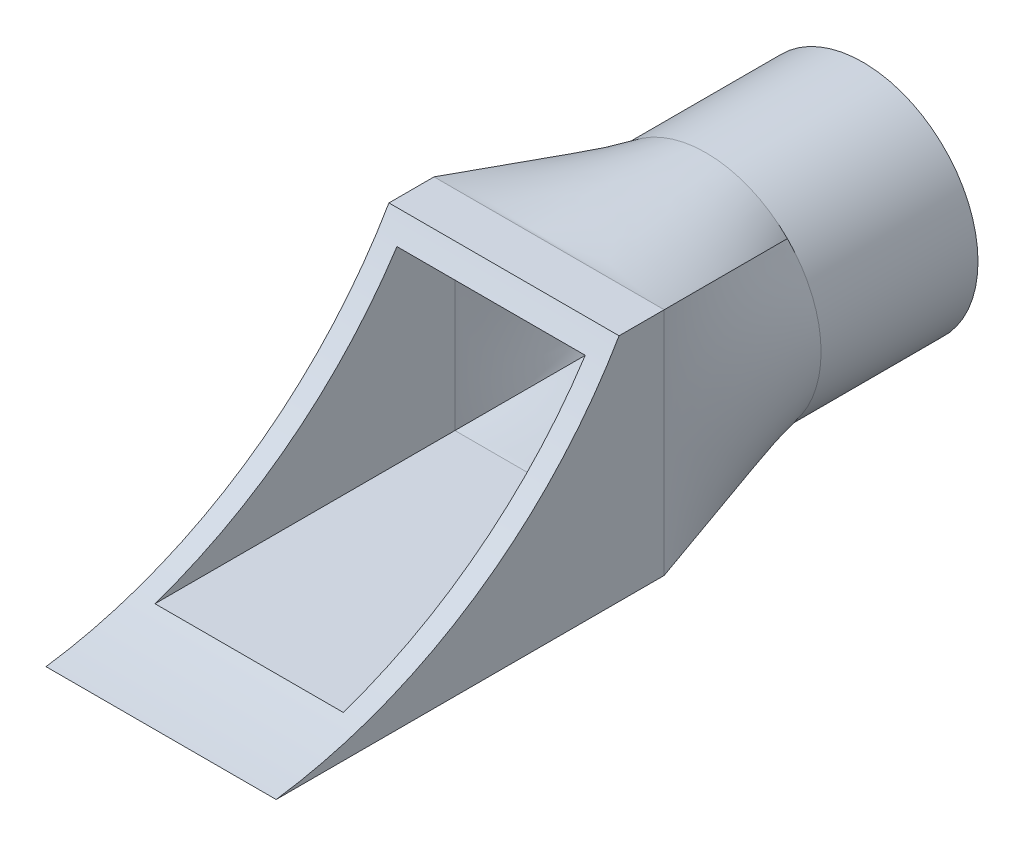
ISO-10303-21;
HEADER;
FILE_DESCRIPTION(('STEP AP214'),'2;1');
FILE_NAME('part.step','',(''),(''),'','','');
FILE_SCHEMA(('AUTOMOTIVE_DESIGN { 1 0 10303 214 1 1 1 1 }'));
ENDSEC;
DATA;
#1=APPLICATION_CONTEXT('core data for automotive mechanical design processes');
#2=APPLICATION_PROTOCOL_DEFINITION('international standard','automotive_design',2000,#1);
#3=PRODUCT_CONTEXT('',#1,'mechanical');
#4=PRODUCT('Part','Part','',(#3));
#5=PRODUCT_RELATED_PRODUCT_CATEGORY('part','',(#4));
#6=PRODUCT_DEFINITION_FORMATION('','',#4);
#7=PRODUCT_DEFINITION_CONTEXT('part definition',#1,'design');
#8=PRODUCT_DEFINITION('design','',#6,#7);
#9=PRODUCT_DEFINITION_SHAPE('','',#8);
#10=(LENGTH_UNIT() NAMED_UNIT(*) SI_UNIT(.MILLI.,.METRE.));
#11=(NAMED_UNIT(*) PLANE_ANGLE_UNIT() SI_UNIT($,.RADIAN.));
#12=(NAMED_UNIT(*) SI_UNIT($,.STERADIAN.) SOLID_ANGLE_UNIT());
#13=UNCERTAINTY_MEASURE_WITH_UNIT(LENGTH_MEASURE(1.E-05),#10,'distance_accuracy_value','');
#14=(GEOMETRIC_REPRESENTATION_CONTEXT(3) GLOBAL_UNCERTAINTY_ASSIGNED_CONTEXT((#13)) GLOBAL_UNIT_ASSIGNED_CONTEXT((#10,
#11,#12)) REPRESENTATION_CONTEXT('',''));
#15=CARTESIAN_POINT('',(0.,0.,0.));
#16=DIRECTION('',(0.,0.,1.));
#17=DIRECTION('',(1.,0.,0.));
#18=AXIS2_PLACEMENT_3D('',#15,#16,#17);
#19=CARTESIAN_POINT('',(-65.7874671161702,179.354700098905,15.));
#20=CARTESIAN_POINT('',(-62.5656417092223,176.132874691957,0.));
#21=CARTESIAN_POINT('',(-64.8708004495035,179.354700098905,15.));
#22=CARTESIAN_POINT('',(-62.1073083758889,176.591208025291,0.));
#23=CARTESIAN_POINT('',(-63.9541337828369,179.354700098905,15.));
#24=CARTESIAN_POINT('',(-61.5910902169784,177.025936624902,0.));
#25=CARTESIAN_POINT('',(-62.1208004495035,179.354700098905,15.));
#26=CARTESIAN_POINT('',(-60.4498049007283,177.810786022859,0.));
#27=CARTESIAN_POINT('',(-61.2041337828368,179.354700098905,15.));
#28=CARTESIAN_POINT('',(-59.8246794607797,178.160652707059,0.));
#29=CARTESIAN_POINT('',(-59.3708004495035,179.354700098905,15.));
#30=CARTESIAN_POINT('',(-58.4881564165403,178.739068806735,0.));
#31=CARTESIAN_POINT('',(-58.4541337828368,179.354700098905,15.));
#32=CARTESIAN_POINT('',(-57.7768634497798,178.96733471297,0.));
#33=CARTESIAN_POINT('',(-56.6208004495035,179.354700098905,15.));
#34=CARTESIAN_POINT('',(-56.3060792205785,179.275245926261,0.));
#35=CARTESIAN_POINT('',(-55.7041337828368,179.354700098905,15.));
#36=CARTESIAN_POINT('',(-55.5468586471876,179.354700098905,0.));
#37=CARTESIAN_POINT('',(-53.8708004495035,179.354700098905,15.));
#38=CARTESIAN_POINT('',(-54.0280755851529,179.354700098905,0.));
#39=CARTESIAN_POINT('',(-52.9541337828368,179.354700098905,15.));
#40=CARTESIAN_POINT('',(-53.2688550117619,179.275245926261,0.));
#41=CARTESIAN_POINT('',(-51.1208004495035,179.354700098905,15.));
#42=CARTESIAN_POINT('',(-51.7980707825607,178.96733471297,0.));
#43=CARTESIAN_POINT('',(-50.2041337828368,179.354700098905,15.));
#44=CARTESIAN_POINT('',(-51.0867778158001,178.739068806735,0.));
#45=CARTESIAN_POINT('',(-48.3708004495035,179.354700098905,15.));
#46=CARTESIAN_POINT('',(-49.7502547715608,178.160652707059,0.));
#47=CARTESIAN_POINT('',(-47.4541337828368,179.354700098905,15.));
#48=CARTESIAN_POINT('',(-49.1251293316122,177.81078602286,0.));
#49=CARTESIAN_POINT('',(-45.6208004495035,179.354700098905,15.));
#50=CARTESIAN_POINT('',(-47.9838440153621,177.025936624902,0.));
#51=CARTESIAN_POINT('',(-44.7041337828369,179.354700098905,15.));
#52=CARTESIAN_POINT('',(-47.4676258564516,176.591208025291,0.));
#53=CARTESIAN_POINT('',(-43.7874671161702,179.354700098905,15.));
#54=CARTESIAN_POINT('',(-47.0092925231182,176.132874691957,0.));
#55=B_SPLINE_SURFACE_WITH_KNOTS('',3,1,((#19,#20),(#21,#22),(#23,#24),(#25,#26),(#27,#28),(#29,
#30),(#31,#32),(#33,#34),(#35,#36),(#37,#38),(#39,#40),(#41,#42),(#43,#44),(#45,#46),(#47,#48),
(#49,#50),(#51,#52),(#53,#54)),.UNSPECIFIED.,.F.,.F.,.F.,(4,2,2,2,2,2,2,2,4),(2,2),(0.,0.125,
0.25,0.375,0.5,0.625,0.75,0.875,1.),(0.,1.),.UNSPECIFIED.);
#56=DIRECTION('',(1.,0.,0.));
#57=VECTOR('',#56,1.);
#58=CARTESIAN_POINT('',(-65.7874671161702,179.354700098905,15.));
#59=LINE('',#58,#57);
#60=CARTESIAN_POINT('',(-65.7874671161702,179.354700098905,15.));
#61=VERTEX_POINT('',#60);
#62=CARTESIAN_POINT('',(-43.7874671161702,179.354700098905,15.));
#63=VERTEX_POINT('',#62);
#64=EDGE_CURVE('E225',#61,#63,#59,.T.);
#65=DIRECTION('',(-0.205516228726018,-0.205516228726016,-0.956831311914734));
#66=VECTOR('',#65,1.);
#67=CARTESIAN_POINT('',(-45.3983798196442,177.743787395431,7.5));
#68=LINE('',#67,#66);
#69=CARTESIAN_POINT('',(-47.0092925231182,176.132874691957,0.));
#70=VERTEX_POINT('',#69);
#71=EDGE_CURVE('E256',#63,#70,#68,.T.);
#72=CARTESIAN_POINT('',(-54.7874671161702,168.354700098905,0.));
#73=DIRECTION('',(0.,0.,1.));
#74=DIRECTION('',(1.,0.,0.));
#75=AXIS2_PLACEMENT_3D('',#72,#73,#74);
#76=CIRCLE('',#75,11.);
#77=CARTESIAN_POINT('',(-62.5656417092223,176.132874691957,0.));
#78=VERTEX_POINT('',#77);
#79=EDGE_CURVE('E122',#70,#78,#76,.T.);
#80=DIRECTION('',(-0.205516228726017,0.205516228726016,0.956831311914734));
#81=VECTOR('',#80,1.);
#82=CARTESIAN_POINT('',(-64.1765544126962,177.743787395431,7.5));
#83=LINE('',#82,#81);
#84=EDGE_CURVE('E242',#78,#61,#83,.T.);
#85=ORIENTED_EDGE('',*,*,#64,.T.);
#86=ORIENTED_EDGE('',*,*,#71,.T.);
#87=ORIENTED_EDGE('',*,*,#79,.T.);
#88=ORIENTED_EDGE('',*,*,#84,.T.);
#89=EDGE_LOOP('',(#85,#86,#87,#88));
#90=FACE_BOUND('',#89,.T.);
#91=ADVANCED_FACE('F101',(#90),#55,.T.);
#92=CARTESIAN_POINT('',(-43.7874671161702,179.354700098905,15.));
#93=CARTESIAN_POINT('',(-47.0092925231182,176.132874691957,0.));
#94=CARTESIAN_POINT('',(-43.7874671161702,178.438033432238,15.));
#95=CARTESIAN_POINT('',(-46.5509591897849,175.674541358624,0.));
#96=CARTESIAN_POINT('',(-43.7874671161702,177.521366765571,15.));
#97=CARTESIAN_POINT('',(-46.1162305901729,175.158323199713,0.));
#98=CARTESIAN_POINT('',(-43.7874671161702,175.688033432238,15.));
#99=CARTESIAN_POINT('',(-45.3313811922159,174.017037883463,0.));
#100=CARTESIAN_POINT('',(-43.7874671161702,174.771366765571,15.));
#101=CARTESIAN_POINT('',(-44.9815145080168,173.391912443515,0.));
#102=CARTESIAN_POINT('',(-43.7874671161702,172.938033432237,15.));
#103=CARTESIAN_POINT('',(-44.40309840834,172.055389399275,0.));
#104=CARTESIAN_POINT('',(-43.7874671161702,172.021366765571,15.));
#105=CARTESIAN_POINT('',(-44.1748325021059,171.344096432515,0.));
#106=CARTESIAN_POINT('',(-43.7874671161702,170.188033432237,15.));
#107=CARTESIAN_POINT('',(-43.8669212888144,169.873312203313,0.));
#108=CARTESIAN_POINT('',(-43.7874671161702,169.27136676557,15.));
#109=CARTESIAN_POINT('',(-43.7874671161702,169.114091629922,0.));
#110=CARTESIAN_POINT('',(-43.7874671161702,167.438033432237,15.));
#111=CARTESIAN_POINT('',(-43.7874671161702,167.595308567888,0.));
#112=CARTESIAN_POINT('',(-43.7874671161702,166.52136676557,15.));
#113=CARTESIAN_POINT('',(-43.8669212888144,166.836087994497,0.));
#114=CARTESIAN_POINT('',(-43.7874671161702,164.688033432237,15.));
#115=CARTESIAN_POINT('',(-44.1748325021059,165.365303765296,0.));
#116=CARTESIAN_POINT('',(-43.7874671161702,163.771366765571,15.));
#117=CARTESIAN_POINT('',(-44.40309840834,164.654010798535,0.));
#118=CARTESIAN_POINT('',(-43.7874671161702,161.938033432238,15.));
#119=CARTESIAN_POINT('',(-44.9815145080168,163.317487754296,0.));
#120=CARTESIAN_POINT('',(-43.7874671161702,161.021366765571,15.));
#121=CARTESIAN_POINT('',(-45.331381192216,162.692362314347,0.));
#122=CARTESIAN_POINT('',(-43.7874671161702,159.188033432238,15.));
#123=CARTESIAN_POINT('',(-46.1162305901729,161.551076998097,0.));
#124=CARTESIAN_POINT('',(-43.7874671161702,158.271366765572,15.));
#125=CARTESIAN_POINT('',(-46.5509591897849,161.034858839187,0.));
#126=CARTESIAN_POINT('',(-43.7874671161702,157.354700098905,15.));
#127=CARTESIAN_POINT('',(-47.0092925231182,160.576525505853,0.));
#128=B_SPLINE_SURFACE_WITH_KNOTS('',3,1,((#92,#93),(#94,#95),(#96,#97),(#98,#99),(#100,#101),
(#102,#103),(#104,#105),(#106,#107),(#108,#109),(#110,#111),(#112,#113),(#114,#115),(#116,#117),
(#118,#119),(#120,#121),(#122,#123),(#124,#125),(#126,#127)),.UNSPECIFIED.,.F.,.F.,.F.,(4,2,2,2,
2,2,2,2,4),(2,2),(0.,0.125,0.25,0.375,0.5,0.625,0.75,0.875,1.),(0.,1.),.UNSPECIFIED.);
#129=DIRECTION('',(0.,1.,0.));
#130=VECTOR('',#129,1.);
#131=CARTESIAN_POINT('',(-43.7874671161702,157.354700098905,15.));
#132=LINE('',#131,#130);
#133=CARTESIAN_POINT('',(-43.7874671161702,157.354700098905,15.));
#134=VERTEX_POINT('',#133);
#135=EDGE_CURVE('E131',#134,#63,#132,.T.);
#136=DIRECTION('',(-0.205516228726018,0.205516228726018,-0.956831311914734));
#137=VECTOR('',#136,1.);
#138=CARTESIAN_POINT('',(-45.3983798196442,158.965612802379,7.5));
#139=LINE('',#138,#137);
#140=CARTESIAN_POINT('',(-47.0092925231182,160.576525505853,0.));
#141=VERTEX_POINT('',#140);
#142=EDGE_CURVE('E237',#134,#141,#139,.T.);
#143=EDGE_CURVE('E114',#141,#70,#76,.T.);
#144=ORIENTED_EDGE('',*,*,#135,.F.);
#145=ORIENTED_EDGE('',*,*,#142,.T.);
#146=ORIENTED_EDGE('',*,*,#143,.T.);
#147=ORIENTED_EDGE('',*,*,#71,.F.);
#148=EDGE_LOOP('',(#144,#145,#146,#147));
#149=FACE_BOUND('',#148,.T.);
#150=ADVANCED_FACE('F275',(#149),#128,.T.);
#151=CARTESIAN_POINT('',(-65.7874671161702,157.354700098905,15.));
#152=CARTESIAN_POINT('',(-62.5656417092223,160.576525505853,0.));
#153=CARTESIAN_POINT('',(-65.7874671161702,158.271366765572,15.));
#154=CARTESIAN_POINT('',(-63.0239750425556,161.034858839187,0.));
#155=CARTESIAN_POINT('',(-65.7874671161702,159.188033432239,15.));
#156=CARTESIAN_POINT('',(-63.4587036421675,161.551076998097,0.));
#157=CARTESIAN_POINT('',(-65.7874671161702,161.021366765572,15.));
#158=CARTESIAN_POINT('',(-64.2435530401245,162.692362314347,0.));
#159=CARTESIAN_POINT('',(-65.7874671161702,161.938033432239,15.));
#160=CARTESIAN_POINT('',(-64.5934197243237,163.317487754296,0.));
#161=CARTESIAN_POINT('',(-65.7874671161702,163.771366765572,15.));
#162=CARTESIAN_POINT('',(-65.1718358240005,164.654010798535,0.));
#163=CARTESIAN_POINT('',(-65.7874671161702,164.688033432239,15.));
#164=CARTESIAN_POINT('',(-65.4001017302346,165.365303765296,0.));
#165=CARTESIAN_POINT('',(-65.7874671161702,166.521366765572,15.));
#166=CARTESIAN_POINT('',(-65.7080129435261,166.836087994497,0.));
#167=CARTESIAN_POINT('',(-65.7874671161702,167.438033432239,15.));
#168=CARTESIAN_POINT('',(-65.7874671161702,167.595308567888,0.));
#169=CARTESIAN_POINT('',(-65.7874671161702,169.271366765572,15.));
#170=CARTESIAN_POINT('',(-65.7874671161702,169.114091629923,0.));
#171=CARTESIAN_POINT('',(-65.7874671161702,170.188033432239,15.));
#172=CARTESIAN_POINT('',(-65.7080129435261,169.873312203313,0.));
#173=CARTESIAN_POINT('',(-65.7874671161702,172.021366765572,15.));
#174=CARTESIAN_POINT('',(-65.4001017302345,171.344096432515,0.));
#175=CARTESIAN_POINT('',(-65.7874671161702,172.938033432239,15.));
#176=CARTESIAN_POINT('',(-65.1718358240005,172.055389399275,0.));
#177=CARTESIAN_POINT('',(-65.7874671161702,174.771366765572,15.));
#178=CARTESIAN_POINT('',(-64.5934197243237,173.391912443515,0.));
#179=CARTESIAN_POINT('',(-65.7874671161702,175.688033432239,15.));
#180=CARTESIAN_POINT('',(-64.2435530401245,174.017037883463,0.));
#181=CARTESIAN_POINT('',(-65.7874671161702,177.521366765572,15.));
#182=CARTESIAN_POINT('',(-63.4587036421675,175.158323199713,0.));
#183=CARTESIAN_POINT('',(-65.7874671161702,178.438033432239,15.));
#184=CARTESIAN_POINT('',(-63.0239750425556,175.674541358624,0.));
#185=CARTESIAN_POINT('',(-65.7874671161702,179.354700098905,15.));
#186=CARTESIAN_POINT('',(-62.5656417092223,176.132874691957,0.));
#187=B_SPLINE_SURFACE_WITH_KNOTS('',3,1,((#151,#152),(#153,#154),(#155,#156),(#157,#158),(#159,
#160),(#161,#162),(#163,#164),(#165,#166),(#167,#168),(#169,#170),(#171,#172),(#173,#174),(#175,
#176),(#177,#178),(#179,#180),(#181,#182),(#183,#184),(#185,#186)),.UNSPECIFIED.,.F.,.F.,.F.,(4,
2,2,2,2,2,2,2,4),(2,2),(0.,0.125,0.25,0.375,0.5,0.625,0.75,0.875,1.),(0.,1.),.UNSPECIFIED.);
#188=DIRECTION('',(0.,1.,0.));
#189=VECTOR('',#188,1.);
#190=CARTESIAN_POINT('',(-65.7874671161702,157.354700098905,15.));
#191=LINE('',#190,#189);
#192=CARTESIAN_POINT('',(-65.7874671161702,157.354700098905,15.));
#193=VERTEX_POINT('',#192);
#194=EDGE_CURVE('E214',#193,#61,#191,.T.);
#195=CARTESIAN_POINT('',(-62.5656417092223,160.576525505853,0.));
#196=VERTEX_POINT('',#195);
#197=EDGE_CURVE('E234',#78,#196,#76,.T.);
#198=DIRECTION('',(0.205516228726017,0.205516228726018,-0.956831311914734));
#199=VECTOR('',#198,1.);
#200=CARTESIAN_POINT('',(-64.1765544126962,158.965612802379,7.5));
#201=LINE('',#200,#199);
#202=EDGE_CURVE('E232',#193,#196,#201,.T.);
#203=ORIENTED_EDGE('',*,*,#194,.T.);
#204=ORIENTED_EDGE('',*,*,#84,.F.);
#205=ORIENTED_EDGE('',*,*,#197,.T.);
#206=ORIENTED_EDGE('',*,*,#202,.F.);
#207=EDGE_LOOP('',(#203,#204,#205,#206));
#208=FACE_BOUND('',#207,.T.);
#209=ADVANCED_FACE('F233',(#208),#187,.T.);
#210=CARTESIAN_POINT('',(-43.7874671161702,157.354700098905,15.));
#211=CARTESIAN_POINT('',(-47.0092925231182,160.576525505853,0.));
#212=CARTESIAN_POINT('',(-44.7041337828369,157.354700098905,15.));
#213=CARTESIAN_POINT('',(-47.4676258564516,160.11819217252,0.));
#214=CARTESIAN_POINT('',(-45.6208004495036,157.354700098905,15.));
#215=CARTESIAN_POINT('',(-47.9838440153621,159.683463572908,0.));
#216=CARTESIAN_POINT('',(-47.4541337828369,157.354700098905,15.));
#217=CARTESIAN_POINT('',(-49.1251293316122,158.898614174951,0.));
#218=CARTESIAN_POINT('',(-48.3708004495036,157.354700098905,15.));
#219=CARTESIAN_POINT('',(-49.7502547715608,158.548747490752,0.));
#220=CARTESIAN_POINT('',(-50.2041337828369,157.354700098905,15.));
#221=CARTESIAN_POINT('',(-51.0867778158002,157.970331391075,0.));
#222=CARTESIAN_POINT('',(-51.1208004495036,157.354700098905,15.));
#223=CARTESIAN_POINT('',(-51.7980707825607,157.742065484841,0.));
#224=CARTESIAN_POINT('',(-52.9541337828369,157.354700098905,15.));
#225=CARTESIAN_POINT('',(-53.2688550117619,157.434154271549,0.));
#226=CARTESIAN_POINT('',(-53.8708004495036,157.354700098905,15.));
#227=CARTESIAN_POINT('',(-54.0280755851529,157.354700098905,0.));
#228=CARTESIAN_POINT('',(-55.7041337828369,157.354700098905,15.));
#229=CARTESIAN_POINT('',(-55.5468586471876,157.354700098905,0.));
#230=CARTESIAN_POINT('',(-56.6208004495036,157.354700098905,15.));
#231=CARTESIAN_POINT('',(-56.3060792205785,157.434154271549,0.));
#232=CARTESIAN_POINT('',(-58.4541337828369,157.354700098905,15.));
#233=CARTESIAN_POINT('',(-57.7768634497798,157.742065484841,0.));
#234=CARTESIAN_POINT('',(-59.3708004495036,157.354700098905,15.));
#235=CARTESIAN_POINT('',(-58.4881564165403,157.970331391075,0.));
#236=CARTESIAN_POINT('',(-61.2041337828369,157.354700098905,15.));
#237=CARTESIAN_POINT('',(-59.8246794607797,158.548747490752,0.));
#238=CARTESIAN_POINT('',(-62.1208004495036,157.354700098905,15.));
#239=CARTESIAN_POINT('',(-60.4498049007283,158.898614174951,0.));
#240=CARTESIAN_POINT('',(-63.9541337828369,157.354700098905,15.));
#241=CARTESIAN_POINT('',(-61.5910902169784,159.683463572908,0.));
#242=CARTESIAN_POINT('',(-64.8708004495036,157.354700098905,15.));
#243=CARTESIAN_POINT('',(-62.1073083758889,160.11819217252,0.));
#244=CARTESIAN_POINT('',(-65.7874671161702,157.354700098905,15.));
#245=CARTESIAN_POINT('',(-62.5656417092223,160.576525505853,0.));
#246=B_SPLINE_SURFACE_WITH_KNOTS('',3,1,((#210,#211),(#212,#213),(#214,#215),(#216,#217),(#218,
#219),(#220,#221),(#222,#223),(#224,#225),(#226,#227),(#228,#229),(#230,#231),(#232,#233),(#234,
#235),(#236,#237),(#238,#239),(#240,#241),(#242,#243),(#244,#245)),.UNSPECIFIED.,.F.,.F.,.F.,(4,
2,2,2,2,2,2,2,4),(2,2),(0.,0.125,0.25,0.375,0.5,0.625,0.75,0.875,1.),(0.,1.),.UNSPECIFIED.);
#247=DIRECTION('',(1.,0.,0.));
#248=VECTOR('',#247,1.);
#249=CARTESIAN_POINT('',(-65.7874671161702,157.354700098905,15.));
#250=LINE('',#249,#248);
#251=EDGE_CURVE('E205',#193,#134,#250,.T.);
#252=EDGE_CURVE('E12',#196,#141,#76,.T.);
#253=ORIENTED_EDGE('',*,*,#251,.F.);
#254=ORIENTED_EDGE('',*,*,#202,.T.);
#255=ORIENTED_EDGE('',*,*,#252,.T.);
#256=ORIENTED_EDGE('',*,*,#142,.F.);
#257=EDGE_LOOP('',(#253,#254,#255,#256));
#258=FACE_BOUND('',#257,.T.);
#259=ADVANCED_FACE('F103',(#258),#246,.T.);
#260=CARTESIAN_POINT('',(-61.1514281468492,174.718661129584,0.));
#261=CARTESIAN_POINT('',(-63.7874671161702,177.354700098905,15.));
#262=CARTESIAN_POINT('',(-61.5264281468491,174.343661129584,0.));
#263=CARTESIAN_POINT('',(-63.7874671161702,176.604700098905,15.));
#264=CARTESIAN_POINT('',(-61.8821151828953,173.921300817748,0.));
#265=CARTESIAN_POINT('',(-63.7874671161702,175.854700098905,15.));
#266=CARTESIAN_POINT('',(-62.5242646903146,172.987521922635,0.));
#267=CARTESIAN_POINT('',(-63.7874671161702,174.354700098905,15.));
#268=CARTESIAN_POINT('',(-62.8105192501139,172.476055653586,0.));
#269=CARTESIAN_POINT('',(-63.7874671161702,173.604700098904,15.));
#270=CARTESIAN_POINT('',(-63.2837687862132,171.382536799208,0.));
#271=CARTESIAN_POINT('',(-63.7874671161702,172.104700098904,15.));
#272=CARTESIAN_POINT('',(-63.4705318004047,170.800569826404,0.));
#273=CARTESIAN_POINT('',(-63.7874671161702,171.354700098904,15.));
#274=CARTESIAN_POINT('',(-63.7224591567341,169.597200911603,0.));
#275=CARTESIAN_POINT('',(-63.7874671161702,169.854700098904,15.));
#276=CARTESIAN_POINT('',(-63.7874671161703,168.976020442465,0.));
#277=CARTESIAN_POINT('',(-63.7874671161702,169.104700098904,15.));
#278=CARTESIAN_POINT('',(-63.7874671161703,167.733379755346,0.));
#279=CARTESIAN_POINT('',(-63.7874671161702,167.604700098904,15.));
#280=CARTESIAN_POINT('',(-63.7224591567341,167.112199286208,0.));
#281=CARTESIAN_POINT('',(-63.7874671161702,166.854700098904,15.));
#282=CARTESIAN_POINT('',(-63.4705318004047,165.908830371406,0.));
#283=CARTESIAN_POINT('',(-63.7874671161702,165.354700098904,15.));
#284=CARTESIAN_POINT('',(-63.2837687862131,165.326863398602,0.));
#285=CARTESIAN_POINT('',(-63.7874671161702,164.604700098904,15.));
#286=CARTESIAN_POINT('',(-62.8105192501139,164.233344544225,0.));
#287=CARTESIAN_POINT('',(-63.7874671161702,163.104700098904,15.));
#288=CARTESIAN_POINT('',(-62.5242646903147,163.721878275176,0.));
#289=CARTESIAN_POINT('',(-63.7874671161702,162.354700098905,15.));
#290=CARTESIAN_POINT('',(-61.8821151828953,162.788099380062,0.));
#291=CARTESIAN_POINT('',(-63.7874671161702,160.854700098905,15.));
#292=CARTESIAN_POINT('',(-61.5264281468492,162.365739068226,0.));
#293=CARTESIAN_POINT('',(-63.7874671161702,160.104700098905,15.));
#294=CARTESIAN_POINT('',(-61.1514281468492,161.990739068226,0.));
#295=CARTESIAN_POINT('',(-63.7874671161702,159.354700098905,15.));
#296=B_SPLINE_SURFACE_WITH_KNOTS('',3,1,((#260,#261),(#262,#263),(#264,#265),(#266,#267),(#268,
#269),(#270,#271),(#272,#273),(#274,#275),(#276,#277),(#278,#279),(#280,#281),(#282,#283),(#284,
#285),(#286,#287),(#288,#289),(#290,#291),(#292,#293),(#294,#295)),.UNSPECIFIED.,.F.,.F.,.F.,(4,
2,2,2,2,2,2,2,4),(2,2),(0.,0.125000000000001,0.25,0.375,0.5,0.625,0.75,0.874999999999999,1.),
(0.,1.),.UNSPECIFIED.);
#297=CARTESIAN_POINT('',(-54.7874671161702,168.354700098905,0.));
#298=DIRECTION('',(0.,0.,1.));
#299=DIRECTION('',(1.,0.,0.));
#300=AXIS2_PLACEMENT_3D('',#297,#298,#299);
#301=CIRCLE('',#300,9.00000000000001);
#302=CARTESIAN_POINT('',(-61.1514281468492,174.718661129584,0.));
#303=VERTEX_POINT('',#302);
#304=CARTESIAN_POINT('',(-61.1514281468492,161.990739068226,0.));
#305=VERTEX_POINT('',#304);
#306=EDGE_CURVE('E326',#303,#305,#301,.T.);
#307=DIRECTION('',(0.170547796263502,-0.170547796263502,-0.970477665059493));
#308=VECTOR('',#307,1.);
#309=CARTESIAN_POINT('',(-62.4694476315097,176.036680614245,7.5));
#310=LINE('',#309,#308);
#311=CARTESIAN_POINT('',(-63.7874671161702,177.354700098905,15.));
#312=VERTEX_POINT('',#311);
#313=EDGE_CURVE('E312',#312,#303,#310,.T.);
#314=DIRECTION('',(0.,1.,0.));
#315=VECTOR('',#314,1.);
#316=CARTESIAN_POINT('',(-63.7874671161702,159.354700098905,15.));
#317=LINE('',#316,#315);
#318=CARTESIAN_POINT('',(-63.7874671161702,159.354700098905,15.));
#319=VERTEX_POINT('',#318);
#320=EDGE_CURVE('E490',#319,#312,#317,.T.);
#321=DIRECTION('',(-0.170547796263502,-0.170547796263503,0.970477665059493));
#322=VECTOR('',#321,1.);
#323=CARTESIAN_POINT('',(-62.4694476315097,160.672719583566,7.5));
#324=LINE('',#323,#322);
#325=EDGE_CURVE('E483',#305,#319,#324,.T.);
#326=ORIENTED_EDGE('',*,*,#306,.F.);
#327=ORIENTED_EDGE('',*,*,#313,.F.);
#328=ORIENTED_EDGE('',*,*,#320,.F.);
#329=ORIENTED_EDGE('',*,*,#325,.F.);
#330=EDGE_LOOP('',(#326,#327,#328,#329));
#331=FACE_BOUND('',#330,.T.);
#332=ADVANCED_FACE('F497',(#331),#296,.F.);
#333=CARTESIAN_POINT('',(-61.1514281468492,161.990739068226,0.));
#334=CARTESIAN_POINT('',(-63.7874671161702,159.354700098905,15.));
#335=CARTESIAN_POINT('',(-60.7764281468491,161.615739068226,0.));
#336=CARTESIAN_POINT('',(-63.0374671161702,159.354700098905,15.));
#337=CARTESIAN_POINT('',(-60.3540678350133,161.26005203218,0.));
#338=CARTESIAN_POINT('',(-62.2874671161702,159.354700098905,15.));
#339=CARTESIAN_POINT('',(-59.4202889398996,160.617902524761,0.));
#340=CARTESIAN_POINT('',(-60.7874671161702,159.354700098905,15.));
#341=CARTESIAN_POINT('',(-58.9088226708507,160.331647964961,0.));
#342=CARTESIAN_POINT('',(-60.0374671161702,159.354700098905,15.));
#343=CARTESIAN_POINT('',(-57.815303816473,159.858398428862,0.));
#344=CARTESIAN_POINT('',(-58.5374671161702,159.354700098905,15.));
#345=CARTESIAN_POINT('',(-57.233336843669,159.671635414671,0.));
#346=CARTESIAN_POINT('',(-57.7874671161702,159.354700098905,15.));
#347=CARTESIAN_POINT('',(-56.0299679288679,159.419708058341,0.));
#348=CARTESIAN_POINT('',(-56.2874671161702,159.354700098905,15.));
#349=CARTESIAN_POINT('',(-55.4087874597299,159.354700098905,0.));
#350=CARTESIAN_POINT('',(-55.5374671161702,159.354700098905,15.));
#351=CARTESIAN_POINT('',(-54.1661467726106,159.354700098905,0.));
#352=CARTESIAN_POINT('',(-54.0374671161702,159.354700098905,15.));
#353=CARTESIAN_POINT('',(-53.5449663034725,159.419708058341,0.));
#354=CARTESIAN_POINT('',(-53.2874671161702,159.354700098905,15.));
#355=CARTESIAN_POINT('',(-52.3415973886715,159.671635414671,0.));
#356=CARTESIAN_POINT('',(-51.7874671161702,159.354700098905,15.));
#357=CARTESIAN_POINT('',(-51.7596304158674,159.858398428862,0.));
#358=CARTESIAN_POINT('',(-51.0374671161702,159.354700098905,15.));
#359=CARTESIAN_POINT('',(-50.6661115614898,160.331647964961,0.));
#360=CARTESIAN_POINT('',(-49.5374671161702,159.354700098905,15.));
#361=CARTESIAN_POINT('',(-50.1546452924409,160.617902524761,0.));
#362=CARTESIAN_POINT('',(-48.7874671161702,159.354700098905,15.));
#363=CARTESIAN_POINT('',(-49.2208663973272,161.26005203218,0.));
#364=CARTESIAN_POINT('',(-47.2874671161702,159.354700098905,15.));
#365=CARTESIAN_POINT('',(-48.7985060854913,161.615739068226,0.));
#366=CARTESIAN_POINT('',(-46.5374671161702,159.354700098905,15.));
#367=CARTESIAN_POINT('',(-48.4235060854913,161.990739068226,0.));
#368=CARTESIAN_POINT('',(-45.7874671161702,159.354700098905,15.));
#369=B_SPLINE_SURFACE_WITH_KNOTS('',3,1,((#333,#334),(#335,#336),(#337,#338),(#339,#340),(#341,
#342),(#343,#344),(#345,#346),(#347,#348),(#349,#350),(#351,#352),(#353,#354),(#355,#356),(#357,
#358),(#359,#360),(#361,#362),(#363,#364),(#365,#366),(#367,#368)),.UNSPECIFIED.,.F.,.F.,.F.,(4,
2,2,2,2,2,2,2,4),(2,2),(0.,0.125,0.25,0.375,0.5,0.625,0.75,0.875,1.),(0.,1.),.UNSPECIFIED.);
#370=CARTESIAN_POINT('',(-48.4235060854913,161.990739068226,0.));
#371=VERTEX_POINT('',#370);
#372=EDGE_CURVE('E314',#305,#371,#301,.T.);
#373=DIRECTION('',(1.,0.,0.));
#374=VECTOR('',#373,1.);
#375=CARTESIAN_POINT('',(-63.7874671161702,159.354700098905,15.));
#376=LINE('',#375,#374);
#377=CARTESIAN_POINT('',(-45.7874671161702,159.354700098905,15.));
#378=VERTEX_POINT('',#377);
#379=EDGE_CURVE('E226',#319,#378,#376,.T.);
#380=DIRECTION('',(0.170547796263504,-0.170547796263503,0.970477665059493));
#381=VECTOR('',#380,1.);
#382=CARTESIAN_POINT('',(-47.1054866008308,160.672719583566,7.5));
#383=LINE('',#382,#381);
#384=EDGE_CURVE('E609',#371,#378,#383,.T.);
#385=ORIENTED_EDGE('',*,*,#372,.F.);
#386=ORIENTED_EDGE('',*,*,#325,.T.);
#387=ORIENTED_EDGE('',*,*,#379,.T.);
#388=ORIENTED_EDGE('',*,*,#384,.F.);
#389=EDGE_LOOP('',(#385,#386,#387,#388));
#390=FACE_BOUND('',#389,.T.);
#391=ADVANCED_FACE('F508',(#390),#369,.F.);
#392=CARTESIAN_POINT('',(-48.4235060854913,174.718661129584,0.));
#393=CARTESIAN_POINT('',(-45.7874671161702,177.354700098905,15.));
#394=CARTESIAN_POINT('',(-48.7985060854913,175.093661129584,0.));
#395=CARTESIAN_POINT('',(-46.5374671161702,177.354700098905,15.));
#396=CARTESIAN_POINT('',(-49.2208663973272,175.44934816563,0.));
#397=CARTESIAN_POINT('',(-47.2874671161702,177.354700098905,15.));
#398=CARTESIAN_POINT('',(-50.1546452924409,176.09149767305,0.));
#399=CARTESIAN_POINT('',(-48.7874671161702,177.354700098905,15.));
#400=CARTESIAN_POINT('',(-50.6661115614898,176.377752232849,0.));
#401=CARTESIAN_POINT('',(-49.5374671161702,177.354700098905,15.));
#402=CARTESIAN_POINT('',(-51.7596304158674,176.851001768948,0.));
#403=CARTESIAN_POINT('',(-51.0374671161702,177.354700098905,15.));
#404=CARTESIAN_POINT('',(-52.3415973886715,177.03776478314,0.));
#405=CARTESIAN_POINT('',(-51.7874671161702,177.354700098905,15.));
#406=CARTESIAN_POINT('',(-53.5449663034725,177.289692139469,0.));
#407=CARTESIAN_POINT('',(-53.2874671161702,177.354700098905,15.));
#408=CARTESIAN_POINT('',(-54.1661467726106,177.354700098905,0.));
#409=CARTESIAN_POINT('',(-54.0374671161702,177.354700098905,15.));
#410=CARTESIAN_POINT('',(-55.4087874597299,177.354700098905,0.));
#411=CARTESIAN_POINT('',(-55.5374671161702,177.354700098905,15.));
#412=CARTESIAN_POINT('',(-56.0299679288679,177.289692139469,0.));
#413=CARTESIAN_POINT('',(-56.2874671161702,177.354700098905,15.));
#414=CARTESIAN_POINT('',(-57.233336843669,177.03776478314,0.));
#415=CARTESIAN_POINT('',(-57.7874671161702,177.354700098905,15.));
#416=CARTESIAN_POINT('',(-57.815303816473,176.851001768948,0.));
#417=CARTESIAN_POINT('',(-58.5374671161702,177.354700098905,15.));
#418=CARTESIAN_POINT('',(-58.9088226708507,176.377752232849,0.));
#419=CARTESIAN_POINT('',(-60.0374671161702,177.354700098905,15.));
#420=CARTESIAN_POINT('',(-59.4202889398996,176.09149767305,0.));
#421=CARTESIAN_POINT('',(-60.7874671161702,177.354700098905,15.));
#422=CARTESIAN_POINT('',(-60.3540678350133,175.44934816563,0.));
#423=CARTESIAN_POINT('',(-62.2874671161702,177.354700098905,15.));
#424=CARTESIAN_POINT('',(-60.7764281468492,175.093661129584,0.));
#425=CARTESIAN_POINT('',(-63.0374671161702,177.354700098905,15.));
#426=CARTESIAN_POINT('',(-61.1514281468492,174.718661129584,0.));
#427=CARTESIAN_POINT('',(-63.7874671161702,177.354700098905,15.));
#428=B_SPLINE_SURFACE_WITH_KNOTS('',3,1,((#392,#393),(#394,#395),(#396,#397),(#398,#399),(#400,
#401),(#402,#403),(#404,#405),(#406,#407),(#408,#409),(#410,#411),(#412,#413),(#414,#415),(#416,
#417),(#418,#419),(#420,#421),(#422,#423),(#424,#425),(#426,#427)),.UNSPECIFIED.,.F.,.F.,.F.,(4,
2,2,2,2,2,2,2,4),(2,2),(0.,0.125,0.25,0.375,0.5,0.625,0.75,0.875,1.),(0.,1.),.UNSPECIFIED.);
#429=CARTESIAN_POINT('',(-48.4235060854913,174.718661129584,0.));
#430=VERTEX_POINT('',#429);
#431=EDGE_CURVE('E313',#430,#303,#301,.T.);
#432=DIRECTION('',(0.170547796263503,0.170547796263502,0.970477665059493));
#433=VECTOR('',#432,1.);
#434=CARTESIAN_POINT('',(-47.1054866008308,176.036680614245,7.5));
#435=LINE('',#434,#433);
#436=CARTESIAN_POINT('',(-45.7874671161702,177.354700098905,15.));
#437=VERTEX_POINT('',#436);
#438=EDGE_CURVE('E608',#430,#437,#435,.T.);
#439=DIRECTION('',(1.,0.,0.));
#440=VECTOR('',#439,1.);
#441=CARTESIAN_POINT('',(-63.7874671161702,177.354700098905,15.));
#442=LINE('',#441,#440);
#443=EDGE_CURVE('E108',#312,#437,#442,.T.);
#444=ORIENTED_EDGE('',*,*,#431,.F.);
#445=ORIENTED_EDGE('',*,*,#438,.T.);
#446=ORIENTED_EDGE('',*,*,#443,.F.);
#447=ORIENTED_EDGE('',*,*,#313,.T.);
#448=EDGE_LOOP('',(#444,#445,#446,#447));
#449=FACE_BOUND('',#448,.T.);
#450=ADVANCED_FACE('F442',(#449),#428,.F.);
#451=CARTESIAN_POINT('',(-48.4235060854913,161.990739068226,0.));
#452=CARTESIAN_POINT('',(-45.7874671161702,159.354700098905,15.));
#453=CARTESIAN_POINT('',(-48.0485060854913,162.365739068226,0.));
#454=CARTESIAN_POINT('',(-45.7874671161702,160.104700098905,15.));
#455=CARTESIAN_POINT('',(-47.6928190494452,162.788099380062,0.));
#456=CARTESIAN_POINT('',(-45.7874671161702,160.854700098905,15.));
#457=CARTESIAN_POINT('',(-47.0506695420258,163.721878275176,0.));
#458=CARTESIAN_POINT('',(-45.7874671161702,162.354700098905,15.));
#459=CARTESIAN_POINT('',(-46.7644149822265,164.233344544225,0.));
#460=CARTESIAN_POINT('',(-45.7874671161702,163.104700098905,15.));
#461=CARTESIAN_POINT('',(-46.2911654461273,165.326863398602,0.));
#462=CARTESIAN_POINT('',(-45.7874671161702,164.604700098905,15.));
#463=CARTESIAN_POINT('',(-46.1044024319358,165.908830371406,0.));
#464=CARTESIAN_POINT('',(-45.7874671161702,165.354700098905,15.));
#465=CARTESIAN_POINT('',(-45.8524750756063,167.112199286207,0.));
#466=CARTESIAN_POINT('',(-45.7874671161702,166.854700098905,15.));
#467=CARTESIAN_POINT('',(-45.7874671161702,167.733379755346,0.));
#468=CARTESIAN_POINT('',(-45.7874671161702,167.604700098905,15.));
#469=CARTESIAN_POINT('',(-45.7874671161702,168.976020442465,0.));
#470=CARTESIAN_POINT('',(-45.7874671161702,169.104700098905,15.));
#471=CARTESIAN_POINT('',(-45.8524750756063,169.597200911603,0.));
#472=CARTESIAN_POINT('',(-45.7874671161702,169.854700098905,15.));
#473=CARTESIAN_POINT('',(-46.1044024319358,170.800569826404,0.));
#474=CARTESIAN_POINT('',(-45.7874671161702,171.354700098905,15.));
#475=CARTESIAN_POINT('',(-46.2911654461273,171.382536799208,0.));
#476=CARTESIAN_POINT('',(-45.7874671161702,172.104700098905,15.));
#477=CARTESIAN_POINT('',(-46.7644149822265,172.476055653586,0.));
#478=CARTESIAN_POINT('',(-45.7874671161702,173.604700098905,15.));
#479=CARTESIAN_POINT('',(-47.0506695420258,172.987521922635,0.));
#480=CARTESIAN_POINT('',(-45.7874671161702,174.354700098905,15.));
#481=CARTESIAN_POINT('',(-47.6928190494451,173.921300817748,0.));
#482=CARTESIAN_POINT('',(-45.7874671161702,175.854700098905,15.));
#483=CARTESIAN_POINT('',(-48.0485060854913,174.343661129584,0.));
#484=CARTESIAN_POINT('',(-45.7874671161702,176.604700098905,15.));
#485=CARTESIAN_POINT('',(-48.4235060854913,174.718661129584,0.));
#486=CARTESIAN_POINT('',(-45.7874671161702,177.354700098905,15.));
#487=B_SPLINE_SURFACE_WITH_KNOTS('',3,1,((#451,#452),(#453,#454),(#455,#456),(#457,#458),(#459,
#460),(#461,#462),(#463,#464),(#465,#466),(#467,#468),(#469,#470),(#471,#472),(#473,#474),(#475,
#476),(#477,#478),(#479,#480),(#481,#482),(#483,#484),(#485,#486)),.UNSPECIFIED.,.F.,.F.,.F.,(4,
2,2,2,2,2,2,2,4),(2,2),(0.,0.125,0.25,0.375,0.5,0.625,0.75,0.875,1.),(0.,1.),.UNSPECIFIED.);
#488=EDGE_CURVE('E308',#371,#430,#301,.T.);
#489=DIRECTION('',(0.,1.,0.));
#490=VECTOR('',#489,1.);
#491=CARTESIAN_POINT('',(-45.7874671161702,159.354700098905,15.));
#492=LINE('',#491,#490);
#493=EDGE_CURVE('E552',#378,#437,#492,.T.);
#494=ORIENTED_EDGE('',*,*,#488,.F.);
#495=ORIENTED_EDGE('',*,*,#384,.T.);
#496=ORIENTED_EDGE('',*,*,#493,.T.);
#497=ORIENTED_EDGE('',*,*,#438,.F.);
#498=EDGE_LOOP('',(#494,#495,#496,#497));
#499=FACE_BOUND('',#498,.T.);
#500=ADVANCED_FACE('F429',(#499),#487,.F.);
#501=CARTESIAN_POINT('',(-54.7874671161702,168.354700098905,-15.));
#502=DIRECTION('',(0.,0.,1.));
#503=DIRECTION('',(1.,0.,0.));
#504=AXIS2_PLACEMENT_3D('',#501,#502,#503);
#505=CYLINDRICAL_SURFACE('',#504,11.);
#506=CARTESIAN_POINT('',(-54.7874671161702,168.354700098905,-15.));
#507=DIRECTION('',(0.,0.,1.));
#508=DIRECTION('',(1.,0.,0.));
#509=AXIS2_PLACEMENT_3D('',#506,#507,#508);
#510=CIRCLE('',#509,11.);
#511=CARTESIAN_POINT('',(-43.7874671161702,168.354700098905,-15.));
#512=VERTEX_POINT('',#511);
#513=EDGE_CURVE('E633',#512,#512,#510,.T.);
#514=ORIENTED_EDGE('',*,*,#513,.T.);
#515=EDGE_LOOP('',(#514));
#516=FACE_BOUND('',#515,.T.);
#517=ORIENTED_EDGE('',*,*,#79,.F.);
#518=ORIENTED_EDGE('',*,*,#143,.F.);
#519=ORIENTED_EDGE('',*,*,#252,.F.);
#520=ORIENTED_EDGE('',*,*,#197,.F.);
#521=EDGE_LOOP('',(#517,#518,#519,#520));
#522=FACE_BOUND('',#521,.T.);
#523=ADVANCED_FACE('F441',(#516,#522),#505,.T.);
#524=CARTESIAN_POINT('',(-54.7874671161702,168.354700098905,-15.));
#525=DIRECTION('',(0.,0.,1.));
#526=DIRECTION('',(1.,0.,0.));
#527=AXIS2_PLACEMENT_3D('',#524,#525,#526);
#528=PLANE('',#527);
#529=CARTESIAN_POINT('',(-54.7874671161702,168.354700098905,-15.));
#530=DIRECTION('',(0.,0.,1.));
#531=DIRECTION('',(1.,0.,0.));
#532=AXIS2_PLACEMENT_3D('',#529,#530,#531);
#533=CIRCLE('',#532,9.00000000000001);
#534=CARTESIAN_POINT('',(-45.7874671161702,168.354700098905,-15.));
#535=VERTEX_POINT('',#534);
#536=EDGE_CURVE('E659',#535,#535,#533,.T.);
#537=ORIENTED_EDGE('',*,*,#536,.T.);
#538=EDGE_LOOP('',(#537));
#539=FACE_BOUND('',#538,.T.);
#540=ORIENTED_EDGE('',*,*,#513,.F.);
#541=EDGE_LOOP('',(#540));
#542=FACE_BOUND('',#541,.T.);
#543=ADVANCED_FACE('F647',(#539,#542),#528,.F.);
#544=CARTESIAN_POINT('',(-54.7874671161702,168.354700098905,-15.));
#545=DIRECTION('',(0.,0.,1.));
#546=DIRECTION('',(1.,0.,0.));
#547=AXIS2_PLACEMENT_3D('',#544,#545,#546);
#548=CYLINDRICAL_SURFACE('',#547,9.00000000000001);
#549=ORIENTED_EDGE('',*,*,#536,.F.);
#550=EDGE_LOOP('',(#549));
#551=FACE_BOUND('',#550,.T.);
#552=ORIENTED_EDGE('',*,*,#431,.T.);
#553=ORIENTED_EDGE('',*,*,#306,.T.);
#554=ORIENTED_EDGE('',*,*,#372,.T.);
#555=ORIENTED_EDGE('',*,*,#488,.T.);
#556=EDGE_LOOP('',(#552,#553,#554,#555));
#557=FACE_BOUND('',#556,.T.);
#558=ADVANCED_FACE('F353',(#551,#557),#548,.F.);
#559=CARTESIAN_POINT('',(0.,179.354700098905,58.238168913128));
#560=DIRECTION('',(0.,1.,0.));
#561=DIRECTION('',(0.,0.,1.));
#562=AXIS2_PLACEMENT_3D('',#559,#560,#561);
#563=PLANE('',#562);
#564=DIRECTION('',(1.,0.,0.));
#565=VECTOR('',#564,1.);
#566=CARTESIAN_POINT('',(-80.9440401796875,179.354700098905,19.3113957088737));
#567=LINE('',#566,#565);
#568=CARTESIAN_POINT('',(-43.7874671161702,179.354700098905,19.3113957088737));
#569=VERTEX_POINT('',#568);
#570=CARTESIAN_POINT('',(-65.7874671161702,179.354700098905,19.3113957088737));
#571=VERTEX_POINT('',#570);
#572=EDGE_CURVE('E662',#569,#571,#567,.F.);
#573=ORIENTED_EDGE('',*,*,#572,.F.);
#574=DIRECTION('',(0.,0.,-1.));
#575=VECTOR('',#574,1.);
#576=CARTESIAN_POINT('',(-43.7874671161702,179.354700098905,58.238168913128));
#577=LINE('',#576,#575);
#578=EDGE_CURVE('E330',#569,#63,#577,.T.);
#579=ORIENTED_EDGE('',*,*,#578,.T.);
#580=ORIENTED_EDGE('',*,*,#64,.F.);
#581=DIRECTION('',(0.,0.,-1.));
#582=VECTOR('',#581,1.);
#583=CARTESIAN_POINT('',(-65.7874671161702,179.354700098905,58.238168913128));
#584=LINE('',#583,#582);
#585=EDGE_CURVE('E219',#571,#61,#584,.T.);
#586=ORIENTED_EDGE('',*,*,#585,.F.);
#587=EDGE_LOOP('',(#573,#579,#580,#586));
#588=FACE_BOUND('',#587,.T.);
#589=ADVANCED_FACE('F342',(#588),#563,.T.);
#590=CARTESIAN_POINT('',(-43.7874671161702,0.,58.238168913128));
#591=DIRECTION('',(-1.,0.,0.));
#592=DIRECTION('',(0.,0.,1.));
#593=AXIS2_PLACEMENT_3D('',#590,#591,#592);
#594=PLANE('',#593);
#595=ORIENTED_EDGE('',*,*,#578,.F.);
#596=CARTESIAN_POINT('',(-43.7874671161702,201.933100849423,58.2371689131276));
#597=DIRECTION('',(-1.,0.,0.));
#598=DIRECTION('',(0.,0.,1.));
#599=AXIS2_PLACEMENT_3D('',#596,#597,#598);
#600=CIRCLE('',#599,45.);
#601=CARTESIAN_POINT('',(-43.7874671161702,157.354700098905,52.0917489497545));
#602=VERTEX_POINT('',#601);
#603=EDGE_CURVE('E666',#569,#602,#600,.T.);
#604=ORIENTED_EDGE('',*,*,#603,.T.);
#605=DIRECTION('',(0.,0.,-1.));
#606=VECTOR('',#605,1.);
#607=CARTESIAN_POINT('',(-43.7874671161702,157.354700098905,58.238168913128));
#608=LINE('',#607,#606);
#609=EDGE_CURVE('E211',#602,#134,#608,.T.);
#610=ORIENTED_EDGE('',*,*,#609,.T.);
#611=ORIENTED_EDGE('',*,*,#135,.T.);
#612=EDGE_LOOP('',(#595,#604,#610,#611));
#613=FACE_BOUND('',#612,.T.);
#614=ADVANCED_FACE('F352',(#613),#594,.F.);
#615=CARTESIAN_POINT('',(0.,157.354700098905,58.238168913128));
#616=DIRECTION('',(0.,1.,0.));
#617=DIRECTION('',(0.,0.,1.));
#618=AXIS2_PLACEMENT_3D('',#615,#616,#617);
#619=PLANE('',#618);
#620=ORIENTED_EDGE('',*,*,#609,.F.);
#621=DIRECTION('',(1.,0.,0.));
#622=VECTOR('',#621,1.);
#623=CARTESIAN_POINT('',(-80.9440401796875,157.354700098905,52.0917489497545));
#624=LINE('',#623,#622);
#625=CARTESIAN_POINT('',(-65.7874671161702,157.354700098905,52.0917489497545));
#626=VERTEX_POINT('',#625);
#627=EDGE_CURVE('E207',#602,#626,#624,.F.);
#628=ORIENTED_EDGE('',*,*,#627,.T.);
#629=DIRECTION('',(0.,0.,-1.));
#630=VECTOR('',#629,1.);
#631=CARTESIAN_POINT('',(-65.7874671161702,157.354700098905,58.238168913128));
#632=LINE('',#631,#630);
#633=EDGE_CURVE('E200',#626,#193,#632,.T.);
#634=ORIENTED_EDGE('',*,*,#633,.T.);
#635=ORIENTED_EDGE('',*,*,#251,.T.);
#636=EDGE_LOOP('',(#620,#628,#634,#635));
#637=FACE_BOUND('',#636,.T.);
#638=ADVANCED_FACE('F203',(#637),#619,.F.);
#639=CARTESIAN_POINT('',(-65.7874671161702,0.,58.238168913128));
#640=DIRECTION('',(-1.,0.,0.));
#641=DIRECTION('',(0.,0.,1.));
#642=AXIS2_PLACEMENT_3D('',#639,#640,#641);
#643=PLANE('',#642);
#644=CARTESIAN_POINT('',(-65.7874671161702,201.933100849423,58.2371689131276));
#645=DIRECTION('',(-1.,0.,0.));
#646=DIRECTION('',(0.,0.,1.));
#647=AXIS2_PLACEMENT_3D('',#644,#645,#646);
#648=CIRCLE('',#647,45.);
#649=EDGE_CURVE('E667',#571,#626,#648,.T.);
#650=ORIENTED_EDGE('',*,*,#649,.F.);
#651=ORIENTED_EDGE('',*,*,#585,.T.);
#652=ORIENTED_EDGE('',*,*,#194,.F.);
#653=ORIENTED_EDGE('',*,*,#633,.F.);
#654=EDGE_LOOP('',(#650,#651,#652,#653));
#655=FACE_BOUND('',#654,.T.);
#656=ADVANCED_FACE('F217',(#655),#643,.T.);
#657=CARTESIAN_POINT('',(0.,177.354700098905,58.238168913128));
#658=DIRECTION('',(0.,1.,0.));
#659=DIRECTION('',(0.,0.,1.));
#660=AXIS2_PLACEMENT_3D('',#657,#658,#659);
#661=PLANE('',#660);
#662=DIRECTION('',(0.,0.,-1.));
#663=VECTOR('',#662,1.);
#664=CARTESIAN_POINT('',(-45.7874671161702,177.354700098905,58.238168913128));
#665=LINE('',#664,#663);
#666=CARTESIAN_POINT('',(-45.7874671161702,177.354700098905,20.5423122805983));
#667=VERTEX_POINT('',#666);
#668=EDGE_CURVE('E210',#667,#437,#665,.T.);
#669=ORIENTED_EDGE('',*,*,#668,.F.);
#670=DIRECTION('',(1.,0.,0.));
#671=VECTOR('',#670,1.);
#672=CARTESIAN_POINT('',(-80.9440401796875,177.354700098905,20.5423122805983));
#673=LINE('',#672,#671);
#674=CARTESIAN_POINT('',(-63.7874671161702,177.354700098905,20.5423122805983));
#675=VERTEX_POINT('',#674);
#676=EDGE_CURVE('E595',#667,#675,#673,.F.);
#677=ORIENTED_EDGE('',*,*,#676,.T.);
#678=DIRECTION('',(0.,0.,-1.));
#679=VECTOR('',#678,1.);
#680=CARTESIAN_POINT('',(-63.7874671161702,177.354700098905,58.238168913128));
#681=LINE('',#680,#679);
#682=EDGE_CURVE('E562',#675,#312,#681,.T.);
#683=ORIENTED_EDGE('',*,*,#682,.T.);
#684=ORIENTED_EDGE('',*,*,#443,.T.);
#685=EDGE_LOOP('',(#669,#677,#683,#684));
#686=FACE_BOUND('',#685,.T.);
#687=ADVANCED_FACE('F574',(#686),#661,.F.);
#688=CARTESIAN_POINT('',(-63.7874671161702,0.,58.238168913128));
#689=DIRECTION('',(-1.,0.,0.));
#690=DIRECTION('',(0.,0.,1.));
#691=AXIS2_PLACEMENT_3D('',#688,#689,#690);
#692=PLANE('',#691);
#693=ORIENTED_EDGE('',*,*,#682,.F.);
#694=CARTESIAN_POINT('',(-63.7874671161702,201.933100849423,58.2371689131276));
#695=DIRECTION('',(-1.,0.,0.));
#696=DIRECTION('',(0.,0.,1.));
#697=AXIS2_PLACEMENT_3D('',#694,#695,#696);
#698=CIRCLE('',#697,45.);
#699=CARTESIAN_POINT('',(-63.7874671161702,159.354700098905,43.674209408676));
#700=VERTEX_POINT('',#699);
#701=EDGE_CURVE('E669',#675,#700,#698,.T.);
#702=ORIENTED_EDGE('',*,*,#701,.T.);
#703=DIRECTION('',(0.,0.,-1.));
#704=VECTOR('',#703,1.);
#705=CARTESIAN_POINT('',(-63.7874671161702,159.354700098905,58.238168913128));
#706=LINE('',#705,#704);
#707=EDGE_CURVE('E586',#700,#319,#706,.T.);
#708=ORIENTED_EDGE('',*,*,#707,.T.);
#709=ORIENTED_EDGE('',*,*,#320,.T.);
#710=EDGE_LOOP('',(#693,#702,#708,#709));
#711=FACE_BOUND('',#710,.T.);
#712=ADVANCED_FACE('F564',(#711),#692,.F.);
#713=CARTESIAN_POINT('',(0.,159.354700098905,58.238168913128));
#714=DIRECTION('',(0.,1.,0.));
#715=DIRECTION('',(0.,0.,1.));
#716=AXIS2_PLACEMENT_3D('',#713,#714,#715);
#717=PLANE('',#716);
#718=DIRECTION('',(1.,0.,0.));
#719=VECTOR('',#718,1.);
#720=CARTESIAN_POINT('',(-80.9440401796875,159.354700098905,43.674209408676));
#721=LINE('',#720,#719);
#722=CARTESIAN_POINT('',(-45.7874671161702,159.354700098905,43.674209408676));
#723=VERTEX_POINT('',#722);
#724=EDGE_CURVE('E674',#723,#700,#721,.F.);
#725=ORIENTED_EDGE('',*,*,#724,.F.);
#726=DIRECTION('',(0.,0.,-1.));
#727=VECTOR('',#726,1.);
#728=CARTESIAN_POINT('',(-45.7874671161702,159.354700098905,58.238168913128));
#729=LINE('',#728,#727);
#730=EDGE_CURVE('E592',#723,#378,#729,.T.);
#731=ORIENTED_EDGE('',*,*,#730,.T.);
#732=ORIENTED_EDGE('',*,*,#379,.F.);
#733=ORIENTED_EDGE('',*,*,#707,.F.);
#734=EDGE_LOOP('',(#725,#731,#732,#733));
#735=FACE_BOUND('',#734,.T.);
#736=ADVANCED_FACE('F573',(#735),#717,.T.);
#737=CARTESIAN_POINT('',(-45.7874671161702,0.,58.238168913128));
#738=DIRECTION('',(-1.,0.,0.));
#739=DIRECTION('',(0.,0.,1.));
#740=AXIS2_PLACEMENT_3D('',#737,#738,#739);
#741=PLANE('',#740);
#742=CARTESIAN_POINT('',(-45.7874671161702,201.933100849423,58.2371689131276));
#743=DIRECTION('',(-1.,0.,0.));
#744=DIRECTION('',(0.,0.,1.));
#745=AXIS2_PLACEMENT_3D('',#742,#743,#744);
#746=CIRCLE('',#745,45.);
#747=EDGE_CURVE('E607',#667,#723,#746,.T.);
#748=ORIENTED_EDGE('',*,*,#747,.F.);
#749=ORIENTED_EDGE('',*,*,#668,.T.);
#750=ORIENTED_EDGE('',*,*,#493,.F.);
#751=ORIENTED_EDGE('',*,*,#730,.F.);
#752=EDGE_LOOP('',(#748,#749,#750,#751));
#753=FACE_BOUND('',#752,.T.);
#754=ADVANCED_FACE('F354',(#753),#741,.T.);
#755=CARTESIAN_POINT('',(-80.9440401796875,201.933100849423,58.2371689131276));
#756=DIRECTION('',(1.,0.,0.));
#757=DIRECTION('',(0.,0.,1.));
#758=AXIS2_PLACEMENT_3D('',#755,#756,#757);
#759=CYLINDRICAL_SURFACE('',#758,45.);
#760=ORIENTED_EDGE('',*,*,#649,.T.);
#761=ORIENTED_EDGE('',*,*,#627,.F.);
#762=ORIENTED_EDGE('',*,*,#603,.F.);
#763=ORIENTED_EDGE('',*,*,#572,.T.);
#764=EDGE_LOOP('',(#760,#761,#762,#763));
#765=FACE_BOUND('',#764,.T.);
#766=ORIENTED_EDGE('',*,*,#747,.T.);
#767=ORIENTED_EDGE('',*,*,#724,.T.);
#768=ORIENTED_EDGE('',*,*,#701,.F.);
#769=ORIENTED_EDGE('',*,*,#676,.F.);
#770=EDGE_LOOP('',(#766,#767,#768,#769));
#771=FACE_BOUND('',#770,.T.);
#772=ADVANCED_FACE('F677',(#765,#771),#759,.F.);
#773=CLOSED_SHELL('',(#91,#150,#209,#259,#332,#391,#450,#500,#523,#543,#558,#589,#614,#638,#656,
#687,#712,#736,#754,#772));
#774=MANIFOLD_SOLID_BREP('B2',#773);
#775=ADVANCED_BREP_SHAPE_REPRESENTATION('',(#18,#774),#14);
#776=SHAPE_DEFINITION_REPRESENTATION(#9,#775);
ENDSEC;
END-ISO-10303-21;
